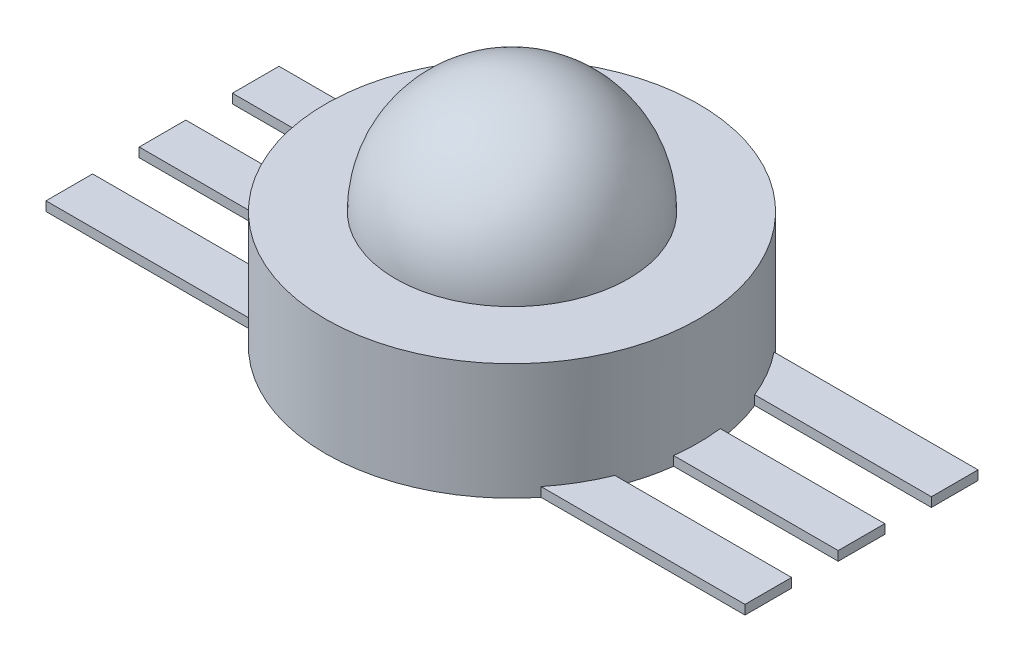
ISO-10303-21;
HEADER;
FILE_DESCRIPTION(('STEP AP214'),'2;1');
FILE_NAME('part.step','',(''),(''),'','','');
FILE_SCHEMA(('AUTOMOTIVE_DESIGN { 1 0 10303 214 1 1 1 1 }'));
ENDSEC;
DATA;
#1=APPLICATION_CONTEXT('core data for automotive mechanical design processes');
#2=APPLICATION_PROTOCOL_DEFINITION('international standard','automotive_design',2000,#1);
#3=PRODUCT_CONTEXT('',#1,'mechanical');
#4=PRODUCT('Part','Part','',(#3));
#5=PRODUCT_RELATED_PRODUCT_CATEGORY('part','',(#4));
#6=PRODUCT_DEFINITION_FORMATION('','',#4);
#7=PRODUCT_DEFINITION_CONTEXT('part definition',#1,'design');
#8=PRODUCT_DEFINITION('design','',#6,#7);
#9=PRODUCT_DEFINITION_SHAPE('','',#8);
#10=(LENGTH_UNIT() NAMED_UNIT(*) SI_UNIT(.MILLI.,.METRE.));
#11=(NAMED_UNIT(*) PLANE_ANGLE_UNIT() SI_UNIT($,.RADIAN.));
#12=(NAMED_UNIT(*) SI_UNIT($,.STERADIAN.) SOLID_ANGLE_UNIT());
#13=UNCERTAINTY_MEASURE_WITH_UNIT(LENGTH_MEASURE(1.E-05),#10,'distance_accuracy_value','');
#14=(GEOMETRIC_REPRESENTATION_CONTEXT(3) GLOBAL_UNCERTAINTY_ASSIGNED_CONTEXT((#13)) GLOBAL_UNIT_ASSIGNED_CONTEXT((#10,
#11,#12)) REPRESENTATION_CONTEXT('',''));
#15=CARTESIAN_POINT('',(0.,0.,0.));
#16=DIRECTION('',(0.,0.,1.));
#17=DIRECTION('',(1.,0.,0.));
#18=AXIS2_PLACEMENT_3D('',#15,#16,#17);
#19=CARTESIAN_POINT('',(0.,2.5,0.));
#20=DIRECTION('',(0.,-1.,0.));
#21=DIRECTION('',(0.,0.,-1.));
#22=AXIS2_PLACEMENT_3D('',#19,#20,#21);
#23=CYLINDRICAL_SURFACE('',#22,4.);
#24=CARTESIAN_POINT('',(0.,2.5,0.));
#25=DIRECTION('',(0.,1.,0.));
#26=DIRECTION('',(0.,0.,1.));
#27=AXIS2_PLACEMENT_3D('',#24,#25,#26);
#28=CIRCLE('',#27,4.);
#29=CARTESIAN_POINT('',(0.,2.5,4.));
#30=VERTEX_POINT('',#29);
#31=EDGE_CURVE('E333',#30,#30,#28,.T.);
#32=ORIENTED_EDGE('',*,*,#31,.F.);
#33=EDGE_LOOP('',(#32));
#34=FACE_BOUND('',#33,.T.);
#35=DIRECTION('',(0.,-1.,0.));
#36=VECTOR('',#35,1.);
#37=CARTESIAN_POINT('',(3.1224989991992,2.5,2.5));
#38=LINE('',#37,#36);
#39=CARTESIAN_POINT('',(3.1224989991992,0.2,2.5));
#40=VERTEX_POINT('',#39);
#41=CARTESIAN_POINT('',(3.1224989991992,0.,2.5));
#42=VERTEX_POINT('',#41);
#43=EDGE_CURVE('E52',#40,#42,#38,.T.);
#44=ORIENTED_EDGE('',*,*,#43,.F.);
#45=CARTESIAN_POINT('',(0.,0.2,0.));
#46=DIRECTION('',(0.,1.,0.));
#47=DIRECTION('',(0.,0.,1.));
#48=AXIS2_PLACEMENT_3D('',#45,#46,#47);
#49=CIRCLE('',#48,4.);
#50=CARTESIAN_POINT('',(3.70809924354783,0.2,1.5));
#51=VERTEX_POINT('',#50);
#52=EDGE_CURVE('E11',#40,#51,#49,.T.);
#53=ORIENTED_EDGE('',*,*,#52,.T.);
#54=DIRECTION('',(0.,-1.,0.));
#55=VECTOR('',#54,1.);
#56=CARTESIAN_POINT('',(3.70809924354783,2.5,1.5));
#57=LINE('',#56,#55);
#58=CARTESIAN_POINT('',(3.70809924354783,0.,1.5));
#59=VERTEX_POINT('',#58);
#60=EDGE_CURVE('E215',#59,#51,#57,.F.);
#61=ORIENTED_EDGE('',*,*,#60,.F.);
#62=CARTESIAN_POINT('',(0.,0.,0.));
#63=DIRECTION('',(0.,1.,0.));
#64=DIRECTION('',(0.,0.,1.));
#65=AXIS2_PLACEMENT_3D('',#62,#63,#64);
#66=CIRCLE('',#65,4.);
#67=CARTESIAN_POINT('',(3.96862696659688,0.,0.500000000000008));
#68=VERTEX_POINT('',#67);
#69=EDGE_CURVE('E341',#59,#68,#66,.T.);
#70=ORIENTED_EDGE('',*,*,#69,.T.);
#71=DIRECTION('',(0.,-1.,0.));
#72=VECTOR('',#71,1.);
#73=CARTESIAN_POINT('',(3.96862696659688,2.5,0.500000000000008));
#74=LINE('',#73,#72);
#75=CARTESIAN_POINT('',(3.96862696659688,0.2,0.500000000000008));
#76=VERTEX_POINT('',#75);
#77=EDGE_CURVE('E276',#76,#68,#74,.T.);
#78=ORIENTED_EDGE('',*,*,#77,.F.);
#79=CARTESIAN_POINT('',(0.,0.2,0.));
#80=DIRECTION('',(0.,1.,0.));
#81=DIRECTION('',(0.,0.,1.));
#82=AXIS2_PLACEMENT_3D('',#79,#80,#81);
#83=CIRCLE('',#82,4.);
#84=CARTESIAN_POINT('',(3.96862696659689,0.2,-0.499999999999989));
#85=VERTEX_POINT('',#84);
#86=EDGE_CURVE('E344',#76,#85,#83,.T.);
#87=ORIENTED_EDGE('',*,*,#86,.T.);
#88=DIRECTION('',(0.,-1.,0.));
#89=VECTOR('',#88,1.);
#90=CARTESIAN_POINT('',(3.96862696659689,2.5,-0.499999999999989));
#91=LINE('',#90,#89);
#92=CARTESIAN_POINT('',(3.96862696659689,0.,-0.499999999999989));
#93=VERTEX_POINT('',#92);
#94=EDGE_CURVE('E267',#93,#85,#91,.F.);
#95=ORIENTED_EDGE('',*,*,#94,.F.);
#96=CARTESIAN_POINT('',(3.70809924354783,0.,-1.5));
#97=VERTEX_POINT('',#96);
#98=EDGE_CURVE('E332',#93,#97,#66,.T.);
#99=ORIENTED_EDGE('',*,*,#98,.T.);
#100=DIRECTION('',(0.,-1.,0.));
#101=VECTOR('',#100,1.);
#102=CARTESIAN_POINT('',(3.70809924354783,2.5,-1.5));
#103=LINE('',#102,#101);
#104=CARTESIAN_POINT('',(3.70809924354783,0.2,-1.5));
#105=VERTEX_POINT('',#104);
#106=EDGE_CURVE('E326',#105,#97,#103,.T.);
#107=ORIENTED_EDGE('',*,*,#106,.F.);
#108=CARTESIAN_POINT('',(0.,0.2,0.));
#109=DIRECTION('',(0.,1.,0.));
#110=DIRECTION('',(0.,0.,1.));
#111=AXIS2_PLACEMENT_3D('',#108,#109,#110);
#112=CIRCLE('',#111,4.);
#113=CARTESIAN_POINT('',(3.1224989991992,0.2,-2.5));
#114=VERTEX_POINT('',#113);
#115=EDGE_CURVE('E342',#105,#114,#112,.T.);
#116=ORIENTED_EDGE('',*,*,#115,.T.);
#117=DIRECTION('',(0.,-1.,0.));
#118=VECTOR('',#117,1.);
#119=CARTESIAN_POINT('',(3.1224989991992,2.5,-2.5));
#120=LINE('',#119,#118);
#121=CARTESIAN_POINT('',(3.1224989991992,0.,-2.5));
#122=VERTEX_POINT('',#121);
#123=EDGE_CURVE('E317',#122,#114,#120,.F.);
#124=ORIENTED_EDGE('',*,*,#123,.F.);
#125=CARTESIAN_POINT('',(-3.1224989991992,0.,-2.5));
#126=VERTEX_POINT('',#125);
#127=EDGE_CURVE('E337',#122,#126,#66,.T.);
#128=ORIENTED_EDGE('',*,*,#127,.T.);
#129=DIRECTION('',(0.,-1.,0.));
#130=VECTOR('',#129,1.);
#131=CARTESIAN_POINT('',(-3.1224989991992,2.5,-2.5));
#132=LINE('',#131,#130);
#133=CARTESIAN_POINT('',(-3.1224989991992,0.2,-2.5));
#134=VERTEX_POINT('',#133);
#135=EDGE_CURVE('E320',#134,#126,#132,.T.);
#136=ORIENTED_EDGE('',*,*,#135,.F.);
#137=CARTESIAN_POINT('',(-3.70809924354783,0.2,-1.5));
#138=VERTEX_POINT('',#137);
#139=EDGE_CURVE('E336',#134,#138,#112,.T.);
#140=ORIENTED_EDGE('',*,*,#139,.T.);
#141=DIRECTION('',(0.,-1.,0.));
#142=VECTOR('',#141,1.);
#143=CARTESIAN_POINT('',(-3.70809924354783,2.5,-1.5));
#144=LINE('',#143,#142);
#145=CARTESIAN_POINT('',(-3.70809924354783,0.,-1.5));
#146=VERTEX_POINT('',#145);
#147=EDGE_CURVE('E323',#146,#138,#144,.F.);
#148=ORIENTED_EDGE('',*,*,#147,.F.);
#149=CARTESIAN_POINT('',(-3.96862696659689,0.,-0.499999999999992));
#150=VERTEX_POINT('',#149);
#151=EDGE_CURVE('E338',#146,#150,#66,.T.);
#152=ORIENTED_EDGE('',*,*,#151,.T.);
#153=DIRECTION('',(0.,-1.,0.));
#154=VECTOR('',#153,1.);
#155=CARTESIAN_POINT('',(-3.96862696659689,2.5,-0.499999999999992));
#156=LINE('',#155,#154);
#157=CARTESIAN_POINT('',(-3.96862696659689,0.2,-0.499999999999992));
#158=VERTEX_POINT('',#157);
#159=EDGE_CURVE('E270',#158,#150,#156,.T.);
#160=ORIENTED_EDGE('',*,*,#159,.F.);
#161=CARTESIAN_POINT('',(-3.96862696659689,0.2,0.499999999999997));
#162=VERTEX_POINT('',#161);
#163=EDGE_CURVE('E343',#158,#162,#83,.T.);
#164=ORIENTED_EDGE('',*,*,#163,.T.);
#165=DIRECTION('',(0.,-1.,0.));
#166=VECTOR('',#165,1.);
#167=CARTESIAN_POINT('',(-3.96862696659689,2.5,0.499999999999997));
#168=LINE('',#167,#166);
#169=CARTESIAN_POINT('',(-3.96862696659689,0.,0.499999999999997));
#170=VERTEX_POINT('',#169);
#171=EDGE_CURVE('E273',#170,#162,#168,.F.);
#172=ORIENTED_EDGE('',*,*,#171,.F.);
#173=CARTESIAN_POINT('',(-3.70809924354783,0.,1.5));
#174=VERTEX_POINT('',#173);
#175=EDGE_CURVE('E340',#170,#174,#66,.T.);
#176=ORIENTED_EDGE('',*,*,#175,.T.);
#177=DIRECTION('',(0.,-1.,0.));
#178=VECTOR('',#177,1.);
#179=CARTESIAN_POINT('',(-3.70809924354783,2.5,1.5));
#180=LINE('',#179,#178);
#181=CARTESIAN_POINT('',(-3.70809924354783,0.2,1.5));
#182=VERTEX_POINT('',#181);
#183=EDGE_CURVE('E217',#182,#174,#180,.T.);
#184=ORIENTED_EDGE('',*,*,#183,.F.);
#185=CARTESIAN_POINT('',(-3.1224989991992,0.2,2.5));
#186=VERTEX_POINT('',#185);
#187=EDGE_CURVE('E38',#182,#186,#49,.T.);
#188=ORIENTED_EDGE('',*,*,#187,.T.);
#189=DIRECTION('',(0.,-1.,0.));
#190=VECTOR('',#189,1.);
#191=CARTESIAN_POINT('',(-3.1224989991992,2.5,2.5));
#192=LINE('',#191,#190);
#193=CARTESIAN_POINT('',(-3.1224989991992,0.,2.5));
#194=VERTEX_POINT('',#193);
#195=EDGE_CURVE('E225',#194,#186,#192,.F.);
#196=ORIENTED_EDGE('',*,*,#195,.F.);
#197=EDGE_CURVE('E367',#194,#42,#66,.T.);
#198=ORIENTED_EDGE('',*,*,#197,.T.);
#199=EDGE_LOOP('',(#44,#53,#61,#70,#78,#87,#95,#99,#107,#116,#124,#128,#136,#140,#148,#152,#160,
#164,#172,#176,#184,#188,#196,#198));
#200=FACE_BOUND('',#199,.T.);
#201=ADVANCED_FACE('F35',(#34,#200),#23,.T.);
#202=CARTESIAN_POINT('',(0.,2.5,0.));
#203=DIRECTION('',(0.,1.,0.));
#204=DIRECTION('',(0.,0.,1.));
#205=AXIS2_PLACEMENT_3D('',#202,#203,#204);
#206=PLANE('',#205);
#207=CARTESIAN_POINT('',(0.,2.5,0.));
#208=DIRECTION('',(0.,-1.,0.));
#209=DIRECTION('',(0.,0.,-1.));
#210=AXIS2_PLACEMENT_3D('',#207,#208,#209);
#211=CIRCLE('',#210,2.5);
#212=CARTESIAN_POINT('',(0.,2.5,-2.5));
#213=VERTEX_POINT('',#212);
#214=EDGE_CURVE('E329',#213,#213,#211,.T.);
#215=ORIENTED_EDGE('',*,*,#214,.T.);
#216=EDGE_LOOP('',(#215));
#217=FACE_BOUND('',#216,.T.);
#218=ORIENTED_EDGE('',*,*,#31,.T.);
#219=EDGE_LOOP('',(#218));
#220=FACE_BOUND('',#219,.T.);
#221=ADVANCED_FACE('F405',(#217,#220),#206,.T.);
#222=CARTESIAN_POINT('',(0.,0.,0.));
#223=DIRECTION('',(0.,1.,0.));
#224=DIRECTION('',(0.,0.,1.));
#225=AXIS2_PLACEMENT_3D('',#222,#223,#224);
#226=PLANE('',#225);
#227=ORIENTED_EDGE('',*,*,#69,.F.);
#228=DIRECTION('',(-1.,0.,0.));
#229=VECTOR('',#228,1.);
#230=CARTESIAN_POINT('',(-7.5,0.,1.5));
#231=LINE('',#230,#229);
#232=CARTESIAN_POINT('',(7.5,0.,1.5));
#233=VERTEX_POINT('',#232);
#234=EDGE_CURVE('E662',#233,#59,#231,.T.);
#235=ORIENTED_EDGE('',*,*,#234,.F.);
#236=DIRECTION('',(0.,0.,-1.));
#237=VECTOR('',#236,1.);
#238=CARTESIAN_POINT('',(7.5,0.,2.5));
#239=LINE('',#238,#237);
#240=CARTESIAN_POINT('',(7.5,0.,2.5));
#241=VERTEX_POINT('',#240);
#242=EDGE_CURVE('E663',#241,#233,#239,.T.);
#243=ORIENTED_EDGE('',*,*,#242,.F.);
#244=DIRECTION('',(1.,0.,0.));
#245=VECTOR('',#244,1.);
#246=CARTESIAN_POINT('',(-7.5,0.,2.5));
#247=LINE('',#246,#245);
#248=EDGE_CURVE('E213',#42,#241,#247,.T.);
#249=ORIENTED_EDGE('',*,*,#248,.F.);
#250=ORIENTED_EDGE('',*,*,#197,.F.);
#251=CARTESIAN_POINT('',(-7.5,0.,2.5));
#252=VERTEX_POINT('',#251);
#253=EDGE_CURVE('E665',#252,#194,#247,.T.);
#254=ORIENTED_EDGE('',*,*,#253,.F.);
#255=DIRECTION('',(0.,0.,1.));
#256=VECTOR('',#255,1.);
#257=CARTESIAN_POINT('',(-7.5,0.,2.5));
#258=LINE('',#257,#256);
#259=CARTESIAN_POINT('',(-7.5,0.,1.5));
#260=VERTEX_POINT('',#259);
#261=EDGE_CURVE('E200',#260,#252,#258,.T.);
#262=ORIENTED_EDGE('',*,*,#261,.F.);
#263=EDGE_CURVE('E658',#174,#260,#231,.T.);
#264=ORIENTED_EDGE('',*,*,#263,.F.);
#265=ORIENTED_EDGE('',*,*,#175,.F.);
#266=DIRECTION('',(1.,0.,0.));
#267=VECTOR('',#266,1.);
#268=CARTESIAN_POINT('',(-7.5,0.,0.499999999999993));
#269=LINE('',#268,#267);
#270=CARTESIAN_POINT('',(-7.5,0.,0.499999999999993));
#271=VERTEX_POINT('',#270);
#272=EDGE_CURVE('E248',#271,#170,#269,.T.);
#273=ORIENTED_EDGE('',*,*,#272,.F.);
#274=DIRECTION('',(0.,0.,1.));
#275=VECTOR('',#274,1.);
#276=CARTESIAN_POINT('',(-7.5,0.,-0.499999999999993));
#277=LINE('',#276,#275);
#278=CARTESIAN_POINT('',(-7.5,0.,-0.499999999999993));
#279=VERTEX_POINT('',#278);
#280=EDGE_CURVE('E229',#279,#271,#277,.T.);
#281=ORIENTED_EDGE('',*,*,#280,.F.);
#282=DIRECTION('',(-1.,0.,0.));
#283=VECTOR('',#282,1.);
#284=CARTESIAN_POINT('',(-7.5,0.,-0.499999999999993));
#285=LINE('',#284,#283);
#286=EDGE_CURVE('E253',#150,#279,#285,.T.);
#287=ORIENTED_EDGE('',*,*,#286,.F.);
#288=ORIENTED_EDGE('',*,*,#151,.F.);
#289=DIRECTION('',(1.,0.,0.));
#290=VECTOR('',#289,1.);
#291=CARTESIAN_POINT('',(-7.5,0.,-1.5));
#292=LINE('',#291,#290);
#293=CARTESIAN_POINT('',(-7.5,0.,-1.5));
#294=VERTEX_POINT('',#293);
#295=EDGE_CURVE('E298',#294,#146,#292,.T.);
#296=ORIENTED_EDGE('',*,*,#295,.F.);
#297=DIRECTION('',(0.,0.,1.));
#298=VECTOR('',#297,1.);
#299=CARTESIAN_POINT('',(-7.5,0.,-2.50000000000001));
#300=LINE('',#299,#298);
#301=CARTESIAN_POINT('',(-7.5,0.,-2.50000000000001));
#302=VERTEX_POINT('',#301);
#303=EDGE_CURVE('E279',#302,#294,#300,.T.);
#304=ORIENTED_EDGE('',*,*,#303,.F.);
#305=DIRECTION('',(-1.,0.,0.));
#306=VECTOR('',#305,1.);
#307=CARTESIAN_POINT('',(-7.5,0.,-2.50000000000001));
#308=LINE('',#307,#306);
#309=EDGE_CURVE('E303',#126,#302,#308,.T.);
#310=ORIENTED_EDGE('',*,*,#309,.F.);
#311=ORIENTED_EDGE('',*,*,#127,.F.);
#312=CARTESIAN_POINT('',(7.5,0.,-2.5));
#313=VERTEX_POINT('',#312);
#314=EDGE_CURVE('E284',#313,#122,#308,.T.);
#315=ORIENTED_EDGE('',*,*,#314,.F.);
#316=DIRECTION('',(0.,0.,-1.));
#317=VECTOR('',#316,1.);
#318=CARTESIAN_POINT('',(7.5,0.,-2.5));
#319=LINE('',#318,#317);
#320=CARTESIAN_POINT('',(7.5,0.,-1.5));
#321=VERTEX_POINT('',#320);
#322=EDGE_CURVE('E301',#321,#313,#319,.T.);
#323=ORIENTED_EDGE('',*,*,#322,.F.);
#324=EDGE_CURVE('E297',#97,#321,#292,.T.);
#325=ORIENTED_EDGE('',*,*,#324,.F.);
#326=ORIENTED_EDGE('',*,*,#98,.F.);
#327=CARTESIAN_POINT('',(7.5,0.,-0.499999999999988));
#328=VERTEX_POINT('',#327);
#329=EDGE_CURVE('E234',#328,#93,#285,.T.);
#330=ORIENTED_EDGE('',*,*,#329,.F.);
#331=DIRECTION('',(0.,0.,-1.));
#332=VECTOR('',#331,1.);
#333=CARTESIAN_POINT('',(7.5,0.,-0.499999999999988));
#334=LINE('',#333,#332);
#335=CARTESIAN_POINT('',(7.5,0.,0.500000000000012));
#336=VERTEX_POINT('',#335);
#337=EDGE_CURVE('E251',#336,#328,#334,.T.);
#338=ORIENTED_EDGE('',*,*,#337,.F.);
#339=EDGE_CURVE('E247',#68,#336,#269,.T.);
#340=ORIENTED_EDGE('',*,*,#339,.F.);
#341=EDGE_LOOP('',(#227,#235,#243,#249,#250,#254,#262,#264,#265,#273,#281,#287,#288,#296,#304,
#310,#311,#315,#323,#325,#326,#330,#338,#340));
#342=FACE_BOUND('',#341,.T.);
#343=ADVANCED_FACE('F363',(#342),#226,.F.);
#344=CARTESIAN_POINT('',(0.,2.5,0.));
#345=DIRECTION('',(0.,-1.,0.));
#346=DIRECTION('',(-1.,0.,0.));
#347=AXIS2_PLACEMENT_3D('',#344,#345,#346);
#348=SPHERICAL_SURFACE('',#347,2.5);
#349=ORIENTED_EDGE('',*,*,#214,.F.);
#350=EDGE_LOOP('',(#349));
#351=FACE_BOUND('',#350,.T.);
#352=ADVANCED_FACE('F417',(#351),#348,.T.);
#353=CARTESIAN_POINT('',(-7.5,0.2,-2.50000000000001));
#354=DIRECTION('',(1.,0.,0.));
#355=DIRECTION('',(0.,0.,-1.));
#356=AXIS2_PLACEMENT_3D('',#353,#354,#355);
#357=PLANE('',#356);
#358=ORIENTED_EDGE('',*,*,#303,.T.);
#359=DIRECTION('',(0.,-1.,0.));
#360=VECTOR('',#359,1.);
#361=CARTESIAN_POINT('',(-7.5,0.2,-1.5));
#362=LINE('',#361,#360);
#363=CARTESIAN_POINT('',(-7.5,0.2,-1.5));
#364=VERTEX_POINT('',#363);
#365=EDGE_CURVE('E314',#364,#294,#362,.T.);
#366=ORIENTED_EDGE('',*,*,#365,.F.);
#367=DIRECTION('',(0.,0.,1.));
#368=VECTOR('',#367,1.);
#369=CARTESIAN_POINT('',(-7.5,0.2,-2.50000000000001));
#370=LINE('',#369,#368);
#371=CARTESIAN_POINT('',(-7.5,0.2,-2.50000000000001));
#372=VERTEX_POINT('',#371);
#373=EDGE_CURVE('E280',#372,#364,#370,.T.);
#374=ORIENTED_EDGE('',*,*,#373,.F.);
#375=DIRECTION('',(0.,-1.,0.));
#376=VECTOR('',#375,1.);
#377=CARTESIAN_POINT('',(-7.5,0.2,-2.50000000000001));
#378=LINE('',#377,#376);
#379=EDGE_CURVE('E294',#372,#302,#378,.T.);
#380=ORIENTED_EDGE('',*,*,#379,.T.);
#381=EDGE_LOOP('',(#358,#366,#374,#380));
#382=FACE_BOUND('',#381,.T.);
#383=ADVANCED_FACE('F421',(#382),#357,.F.);
#384=CARTESIAN_POINT('',(0.,0.2,0.));
#385=DIRECTION('',(0.,1.,0.));
#386=DIRECTION('',(0.,0.,1.));
#387=AXIS2_PLACEMENT_3D('',#384,#385,#386);
#388=PLANE('',#387);
#389=ORIENTED_EDGE('',*,*,#139,.F.);
#390=DIRECTION('',(-1.,0.,0.));
#391=VECTOR('',#390,1.);
#392=CARTESIAN_POINT('',(-7.5,0.2,-2.50000000000001));
#393=LINE('',#392,#391);
#394=EDGE_CURVE('E290',#134,#372,#393,.T.);
#395=ORIENTED_EDGE('',*,*,#394,.T.);
#396=ORIENTED_EDGE('',*,*,#373,.T.);
#397=DIRECTION('',(1.,0.,0.));
#398=VECTOR('',#397,1.);
#399=CARTESIAN_POINT('',(-7.5,0.2,-1.5));
#400=LINE('',#399,#398);
#401=EDGE_CURVE('E285',#364,#138,#400,.T.);
#402=ORIENTED_EDGE('',*,*,#401,.T.);
#403=EDGE_LOOP('',(#389,#395,#396,#402));
#404=FACE_BOUND('',#403,.T.);
#405=ADVANCED_FACE('F425',(#404),#388,.T.);
#406=CARTESIAN_POINT('',(-7.5,0.2,-2.50000000000001));
#407=DIRECTION('',(0.,0.,1.));
#408=DIRECTION('',(1.,0.,0.));
#409=AXIS2_PLACEMENT_3D('',#406,#407,#408);
#410=PLANE('',#409);
#411=ORIENTED_EDGE('',*,*,#394,.F.);
#412=ORIENTED_EDGE('',*,*,#135,.T.);
#413=ORIENTED_EDGE('',*,*,#309,.T.);
#414=ORIENTED_EDGE('',*,*,#379,.F.);
#415=EDGE_LOOP('',(#411,#412,#413,#414));
#416=FACE_BOUND('',#415,.T.);
#417=ADVANCED_FACE('F434',(#416),#410,.F.);
#418=CARTESIAN_POINT('',(-7.5,0.2,-1.5));
#419=DIRECTION('',(0.,0.,-1.));
#420=DIRECTION('',(-1.,0.,0.));
#421=AXIS2_PLACEMENT_3D('',#418,#419,#420);
#422=PLANE('',#421);
#423=ORIENTED_EDGE('',*,*,#295,.T.);
#424=ORIENTED_EDGE('',*,*,#147,.T.);
#425=ORIENTED_EDGE('',*,*,#401,.F.);
#426=ORIENTED_EDGE('',*,*,#365,.T.);
#427=EDGE_LOOP('',(#423,#424,#425,#426));
#428=FACE_BOUND('',#427,.T.);
#429=ADVANCED_FACE('F431',(#428),#422,.F.);
#430=ORIENTED_EDGE('',*,*,#115,.F.);
#431=CARTESIAN_POINT('',(7.5,0.2,-1.5));
#432=VERTEX_POINT('',#431);
#433=EDGE_CURVE('E283',#105,#432,#400,.T.);
#434=ORIENTED_EDGE('',*,*,#433,.T.);
#435=DIRECTION('',(0.,0.,-1.));
#436=VECTOR('',#435,1.);
#437=CARTESIAN_POINT('',(7.5,0.2,-2.5));
#438=LINE('',#437,#436);
#439=CARTESIAN_POINT('',(7.5,0.2,-2.5));
#440=VERTEX_POINT('',#439);
#441=EDGE_CURVE('E288',#432,#440,#438,.T.);
#442=ORIENTED_EDGE('',*,*,#441,.T.);
#443=EDGE_CURVE('E291',#440,#114,#393,.T.);
#444=ORIENTED_EDGE('',*,*,#443,.T.);
#445=EDGE_LOOP('',(#430,#434,#442,#444));
#446=FACE_BOUND('',#445,.T.);
#447=ADVANCED_FACE('F355',(#446),#388,.T.);
#448=ORIENTED_EDGE('',*,*,#433,.F.);
#449=ORIENTED_EDGE('',*,*,#106,.T.);
#450=ORIENTED_EDGE('',*,*,#324,.T.);
#451=DIRECTION('',(0.,-1.,0.));
#452=VECTOR('',#451,1.);
#453=CARTESIAN_POINT('',(7.5,0.2,-1.5));
#454=LINE('',#453,#452);
#455=EDGE_CURVE('E311',#432,#321,#454,.T.);
#456=ORIENTED_EDGE('',*,*,#455,.F.);
#457=EDGE_LOOP('',(#448,#449,#450,#456));
#458=FACE_BOUND('',#457,.T.);
#459=ADVANCED_FACE('F427',(#458),#422,.F.);
#460=ORIENTED_EDGE('',*,*,#314,.T.);
#461=ORIENTED_EDGE('',*,*,#123,.T.);
#462=ORIENTED_EDGE('',*,*,#443,.F.);
#463=DIRECTION('',(0.,-1.,0.));
#464=VECTOR('',#463,1.);
#465=CARTESIAN_POINT('',(7.5,0.2,-2.5));
#466=LINE('',#465,#464);
#467=EDGE_CURVE('E308',#440,#313,#466,.T.);
#468=ORIENTED_EDGE('',*,*,#467,.T.);
#469=EDGE_LOOP('',(#460,#461,#462,#468));
#470=FACE_BOUND('',#469,.T.);
#471=ADVANCED_FACE('F353',(#470),#410,.F.);
#472=CARTESIAN_POINT('',(7.5,0.2,-2.5));
#473=DIRECTION('',(-1.,0.,0.));
#474=DIRECTION('',(0.,0.,1.));
#475=AXIS2_PLACEMENT_3D('',#472,#473,#474);
#476=PLANE('',#475);
#477=ORIENTED_EDGE('',*,*,#322,.T.);
#478=ORIENTED_EDGE('',*,*,#467,.F.);
#479=ORIENTED_EDGE('',*,*,#441,.F.);
#480=ORIENTED_EDGE('',*,*,#455,.T.);
#481=EDGE_LOOP('',(#477,#478,#479,#480));
#482=FACE_BOUND('',#481,.T.);
#483=ADVANCED_FACE('F360',(#482),#476,.F.);
#484=CARTESIAN_POINT('',(-7.5,0.2,-0.499999999999993));
#485=DIRECTION('',(1.,0.,0.));
#486=DIRECTION('',(0.,0.,-1.));
#487=AXIS2_PLACEMENT_3D('',#484,#485,#486);
#488=PLANE('',#487);
#489=ORIENTED_EDGE('',*,*,#280,.T.);
#490=DIRECTION('',(0.,-1.,0.));
#491=VECTOR('',#490,1.);
#492=CARTESIAN_POINT('',(-7.5,0.2,0.499999999999993));
#493=LINE('',#492,#491);
#494=CARTESIAN_POINT('',(-7.5,0.2,0.499999999999993));
#495=VERTEX_POINT('',#494);
#496=EDGE_CURVE('E264',#495,#271,#493,.T.);
#497=ORIENTED_EDGE('',*,*,#496,.F.);
#498=DIRECTION('',(0.,0.,1.));
#499=VECTOR('',#498,1.);
#500=CARTESIAN_POINT('',(-7.5,0.2,-0.499999999999993));
#501=LINE('',#500,#499);
#502=CARTESIAN_POINT('',(-7.5,0.2,-0.499999999999993));
#503=VERTEX_POINT('',#502);
#504=EDGE_CURVE('E230',#503,#495,#501,.T.);
#505=ORIENTED_EDGE('',*,*,#504,.F.);
#506=DIRECTION('',(0.,-1.,0.));
#507=VECTOR('',#506,1.);
#508=CARTESIAN_POINT('',(-7.5,0.2,-0.499999999999993));
#509=LINE('',#508,#507);
#510=EDGE_CURVE('E244',#503,#279,#509,.T.);
#511=ORIENTED_EDGE('',*,*,#510,.T.);
#512=EDGE_LOOP('',(#489,#497,#505,#511));
#513=FACE_BOUND('',#512,.T.);
#514=ADVANCED_FACE('F402',(#513),#488,.F.);
#515=CARTESIAN_POINT('',(0.,0.2,0.));
#516=DIRECTION('',(0.,1.,0.));
#517=DIRECTION('',(0.,0.,1.));
#518=AXIS2_PLACEMENT_3D('',#515,#516,#517);
#519=PLANE('',#518);
#520=ORIENTED_EDGE('',*,*,#163,.F.);
#521=DIRECTION('',(-1.,0.,0.));
#522=VECTOR('',#521,1.);
#523=CARTESIAN_POINT('',(-7.5,0.2,-0.499999999999993));
#524=LINE('',#523,#522);
#525=EDGE_CURVE('E240',#158,#503,#524,.T.);
#526=ORIENTED_EDGE('',*,*,#525,.T.);
#527=ORIENTED_EDGE('',*,*,#504,.T.);
#528=DIRECTION('',(1.,0.,0.));
#529=VECTOR('',#528,1.);
#530=CARTESIAN_POINT('',(-7.5,0.2,0.499999999999993));
#531=LINE('',#530,#529);
#532=EDGE_CURVE('E235',#495,#162,#531,.T.);
#533=ORIENTED_EDGE('',*,*,#532,.T.);
#534=EDGE_LOOP('',(#520,#526,#527,#533));
#535=FACE_BOUND('',#534,.T.);
#536=ADVANCED_FACE('F391',(#535),#519,.T.);
#537=CARTESIAN_POINT('',(-7.5,0.2,-0.499999999999993));
#538=DIRECTION('',(0.,0.,1.));
#539=DIRECTION('',(1.,0.,0.));
#540=AXIS2_PLACEMENT_3D('',#537,#538,#539);
#541=PLANE('',#540);
#542=ORIENTED_EDGE('',*,*,#525,.F.);
#543=ORIENTED_EDGE('',*,*,#159,.T.);
#544=ORIENTED_EDGE('',*,*,#286,.T.);
#545=ORIENTED_EDGE('',*,*,#510,.F.);
#546=EDGE_LOOP('',(#542,#543,#544,#545));
#547=FACE_BOUND('',#546,.T.);
#548=ADVANCED_FACE('F397',(#547),#541,.F.);
#549=CARTESIAN_POINT('',(-7.5,0.2,0.499999999999993));
#550=DIRECTION('',(0.,0.,-1.));
#551=DIRECTION('',(-1.,0.,0.));
#552=AXIS2_PLACEMENT_3D('',#549,#550,#551);
#553=PLANE('',#552);
#554=ORIENTED_EDGE('',*,*,#272,.T.);
#555=ORIENTED_EDGE('',*,*,#171,.T.);
#556=ORIENTED_EDGE('',*,*,#532,.F.);
#557=ORIENTED_EDGE('',*,*,#496,.T.);
#558=EDGE_LOOP('',(#554,#555,#556,#557));
#559=FACE_BOUND('',#558,.T.);
#560=ADVANCED_FACE('F389',(#559),#553,.F.);
#561=ORIENTED_EDGE('',*,*,#86,.F.);
#562=CARTESIAN_POINT('',(7.5,0.2,0.500000000000012));
#563=VERTEX_POINT('',#562);
#564=EDGE_CURVE('E233',#76,#563,#531,.T.);
#565=ORIENTED_EDGE('',*,*,#564,.T.);
#566=DIRECTION('',(0.,0.,-1.));
#567=VECTOR('',#566,1.);
#568=CARTESIAN_POINT('',(7.5,0.2,-0.499999999999988));
#569=LINE('',#568,#567);
#570=CARTESIAN_POINT('',(7.5,0.2,-0.499999999999988));
#571=VERTEX_POINT('',#570);
#572=EDGE_CURVE('E238',#563,#571,#569,.T.);
#573=ORIENTED_EDGE('',*,*,#572,.T.);
#574=EDGE_CURVE('E241',#571,#85,#524,.T.);
#575=ORIENTED_EDGE('',*,*,#574,.T.);
#576=EDGE_LOOP('',(#561,#565,#573,#575));
#577=FACE_BOUND('',#576,.T.);
#578=ADVANCED_FACE('F387',(#577),#519,.T.);
#579=ORIENTED_EDGE('',*,*,#564,.F.);
#580=ORIENTED_EDGE('',*,*,#77,.T.);
#581=ORIENTED_EDGE('',*,*,#339,.T.);
#582=DIRECTION('',(0.,-1.,0.));
#583=VECTOR('',#582,1.);
#584=CARTESIAN_POINT('',(7.5,0.2,0.500000000000012));
#585=LINE('',#584,#583);
#586=EDGE_CURVE('E261',#563,#336,#585,.T.);
#587=ORIENTED_EDGE('',*,*,#586,.F.);
#588=EDGE_LOOP('',(#579,#580,#581,#587));
#589=FACE_BOUND('',#588,.T.);
#590=ADVANCED_FACE('F375',(#589),#553,.F.);
#591=ORIENTED_EDGE('',*,*,#329,.T.);
#592=ORIENTED_EDGE('',*,*,#94,.T.);
#593=ORIENTED_EDGE('',*,*,#574,.F.);
#594=DIRECTION('',(0.,-1.,0.));
#595=VECTOR('',#594,1.);
#596=CARTESIAN_POINT('',(7.5,0.2,-0.499999999999988));
#597=LINE('',#596,#595);
#598=EDGE_CURVE('E258',#571,#328,#597,.T.);
#599=ORIENTED_EDGE('',*,*,#598,.T.);
#600=EDGE_LOOP('',(#591,#592,#593,#599));
#601=FACE_BOUND('',#600,.T.);
#602=ADVANCED_FACE('F385',(#601),#541,.F.);
#603=CARTESIAN_POINT('',(7.5,0.2,-0.499999999999988));
#604=DIRECTION('',(-1.,0.,0.));
#605=DIRECTION('',(0.,0.,1.));
#606=AXIS2_PLACEMENT_3D('',#603,#604,#605);
#607=PLANE('',#606);
#608=ORIENTED_EDGE('',*,*,#337,.T.);
#609=ORIENTED_EDGE('',*,*,#598,.F.);
#610=ORIENTED_EDGE('',*,*,#572,.F.);
#611=ORIENTED_EDGE('',*,*,#586,.T.);
#612=EDGE_LOOP('',(#608,#609,#610,#611));
#613=FACE_BOUND('',#612,.T.);
#614=ADVANCED_FACE('F381',(#613),#607,.F.);
#615=CARTESIAN_POINT('',(-7.5,0.2,2.5));
#616=DIRECTION('',(1.,0.,0.));
#617=DIRECTION('',(0.,0.,-1.));
#618=AXIS2_PLACEMENT_3D('',#615,#616,#617);
#619=PLANE('',#618);
#620=ORIENTED_EDGE('',*,*,#261,.T.);
#621=DIRECTION('',(0.,-1.,0.));
#622=VECTOR('',#621,1.);
#623=CARTESIAN_POINT('',(-7.5,0.2,2.5));
#624=LINE('',#623,#622);
#625=CARTESIAN_POINT('',(-7.5,0.2,2.5));
#626=VERTEX_POINT('',#625);
#627=EDGE_CURVE('E670',#626,#252,#624,.T.);
#628=ORIENTED_EDGE('',*,*,#627,.F.);
#629=DIRECTION('',(0.,0.,1.));
#630=VECTOR('',#629,1.);
#631=CARTESIAN_POINT('',(-7.5,0.2,2.5));
#632=LINE('',#631,#630);
#633=CARTESIAN_POINT('',(-7.5,0.2,1.5));
#634=VERTEX_POINT('',#633);
#635=EDGE_CURVE('E672',#634,#626,#632,.T.);
#636=ORIENTED_EDGE('',*,*,#635,.F.);
#637=DIRECTION('',(0.,-1.,0.));
#638=VECTOR('',#637,1.);
#639=CARTESIAN_POINT('',(-7.5,0.2,1.5));
#640=LINE('',#639,#638);
#641=EDGE_CURVE('E219',#634,#260,#640,.T.);
#642=ORIENTED_EDGE('',*,*,#641,.T.);
#643=EDGE_LOOP('',(#620,#628,#636,#642));
#644=FACE_BOUND('',#643,.T.);
#645=ADVANCED_FACE('F445',(#644),#619,.F.);
#646=CARTESIAN_POINT('',(0.,0.2,0.));
#647=DIRECTION('',(0.,1.,0.));
#648=DIRECTION('',(0.,0.,1.));
#649=AXIS2_PLACEMENT_3D('',#646,#647,#648);
#650=PLANE('',#649);
#651=ORIENTED_EDGE('',*,*,#187,.F.);
#652=DIRECTION('',(-1.,0.,0.));
#653=VECTOR('',#652,1.);
#654=CARTESIAN_POINT('',(-7.5,0.2,1.5));
#655=LINE('',#654,#653);
#656=EDGE_CURVE('E209',#182,#634,#655,.T.);
#657=ORIENTED_EDGE('',*,*,#656,.T.);
#658=ORIENTED_EDGE('',*,*,#635,.T.);
#659=DIRECTION('',(1.,0.,0.));
#660=VECTOR('',#659,1.);
#661=CARTESIAN_POINT('',(-7.5,0.2,2.5));
#662=LINE('',#661,#660);
#663=EDGE_CURVE('E199',#626,#186,#662,.T.);
#664=ORIENTED_EDGE('',*,*,#663,.T.);
#665=EDGE_LOOP('',(#651,#657,#658,#664));
#666=FACE_BOUND('',#665,.T.);
#667=ADVANCED_FACE('F466',(#666),#650,.T.);
#668=CARTESIAN_POINT('',(-7.5,0.2,1.5));
#669=DIRECTION('',(0.,0.,1.));
#670=DIRECTION('',(1.,0.,0.));
#671=AXIS2_PLACEMENT_3D('',#668,#669,#670);
#672=PLANE('',#671);
#673=ORIENTED_EDGE('',*,*,#656,.F.);
#674=ORIENTED_EDGE('',*,*,#183,.T.);
#675=ORIENTED_EDGE('',*,*,#263,.T.);
#676=ORIENTED_EDGE('',*,*,#641,.F.);
#677=EDGE_LOOP('',(#673,#674,#675,#676));
#678=FACE_BOUND('',#677,.T.);
#679=ADVANCED_FACE('F474',(#678),#672,.F.);
#680=CARTESIAN_POINT('',(-7.5,0.2,2.5));
#681=DIRECTION('',(0.,0.,-1.));
#682=DIRECTION('',(-1.,0.,0.));
#683=AXIS2_PLACEMENT_3D('',#680,#681,#682);
#684=PLANE('',#683);
#685=ORIENTED_EDGE('',*,*,#253,.T.);
#686=ORIENTED_EDGE('',*,*,#195,.T.);
#687=ORIENTED_EDGE('',*,*,#663,.F.);
#688=ORIENTED_EDGE('',*,*,#627,.T.);
#689=EDGE_LOOP('',(#685,#686,#687,#688));
#690=FACE_BOUND('',#689,.T.);
#691=ADVANCED_FACE('F482',(#690),#684,.F.);
#692=ORIENTED_EDGE('',*,*,#52,.F.);
#693=CARTESIAN_POINT('',(7.5,0.2,2.5));
#694=VERTEX_POINT('',#693);
#695=EDGE_CURVE('E191',#40,#694,#662,.T.);
#696=ORIENTED_EDGE('',*,*,#695,.T.);
#697=DIRECTION('',(0.,0.,-1.));
#698=VECTOR('',#697,1.);
#699=CARTESIAN_POINT('',(7.5,0.2,2.5));
#700=LINE('',#699,#698);
#701=CARTESIAN_POINT('',(7.5,0.2,1.5));
#702=VERTEX_POINT('',#701);
#703=EDGE_CURVE('E195',#694,#702,#700,.T.);
#704=ORIENTED_EDGE('',*,*,#703,.T.);
#705=EDGE_CURVE('E677',#702,#51,#655,.T.);
#706=ORIENTED_EDGE('',*,*,#705,.T.);
#707=EDGE_LOOP('',(#692,#696,#704,#706));
#708=FACE_BOUND('',#707,.T.);
#709=ADVANCED_FACE('F193',(#708),#650,.T.);
#710=ORIENTED_EDGE('',*,*,#695,.F.);
#711=ORIENTED_EDGE('',*,*,#43,.T.);
#712=ORIENTED_EDGE('',*,*,#248,.T.);
#713=DIRECTION('',(0.,-1.,0.));
#714=VECTOR('',#713,1.);
#715=CARTESIAN_POINT('',(7.5,0.2,2.5));
#716=LINE('',#715,#714);
#717=EDGE_CURVE('E205',#694,#241,#716,.T.);
#718=ORIENTED_EDGE('',*,*,#717,.F.);
#719=EDGE_LOOP('',(#710,#711,#712,#718));
#720=FACE_BOUND('',#719,.T.);
#721=ADVANCED_FACE('F211',(#720),#684,.F.);
#722=ORIENTED_EDGE('',*,*,#234,.T.);
#723=ORIENTED_EDGE('',*,*,#60,.T.);
#724=ORIENTED_EDGE('',*,*,#705,.F.);
#725=DIRECTION('',(0.,-1.,0.));
#726=VECTOR('',#725,1.);
#727=CARTESIAN_POINT('',(7.5,0.2,1.5));
#728=LINE('',#727,#726);
#729=EDGE_CURVE('E207',#702,#233,#728,.T.);
#730=ORIENTED_EDGE('',*,*,#729,.T.);
#731=EDGE_LOOP('',(#722,#723,#724,#730));
#732=FACE_BOUND('',#731,.T.);
#733=ADVANCED_FACE('F485',(#732),#672,.F.);
#734=CARTESIAN_POINT('',(7.5,0.2,2.5));
#735=DIRECTION('',(-1.,0.,0.));
#736=DIRECTION('',(0.,0.,1.));
#737=AXIS2_PLACEMENT_3D('',#734,#735,#736);
#738=PLANE('',#737);
#739=ORIENTED_EDGE('',*,*,#242,.T.);
#740=ORIENTED_EDGE('',*,*,#729,.F.);
#741=ORIENTED_EDGE('',*,*,#703,.F.);
#742=ORIENTED_EDGE('',*,*,#717,.T.);
#743=EDGE_LOOP('',(#739,#740,#741,#742));
#744=FACE_BOUND('',#743,.T.);
#745=ADVANCED_FACE('F204',(#744),#738,.F.);
#746=CLOSED_SHELL('',(#201,#221,#343,#352,#383,#405,#417,#429,#447,#459,#471,#483,#514,#536,
#548,#560,#578,#590,#602,#614,#645,#667,#679,#691,#709,#721,#733,#745));
#747=MANIFOLD_SOLID_BREP('B2',#746);
#748=ADVANCED_BREP_SHAPE_REPRESENTATION('',(#18,#747),#14);
#749=SHAPE_DEFINITION_REPRESENTATION(#9,#748);
ENDSEC;
END-ISO-10303-21;
